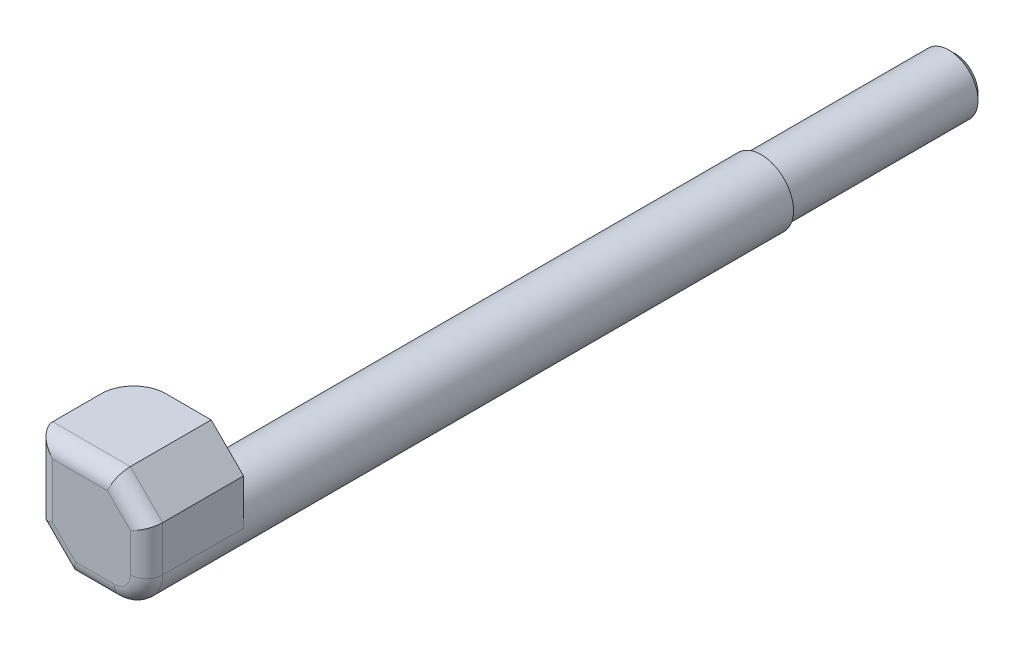
ISO-10303-21;
HEADER;
FILE_DESCRIPTION(('STEP AP214'),'2;1');
FILE_NAME('part.step','',(''),(''),'','','');
FILE_SCHEMA(('AUTOMOTIVE_DESIGN { 1 0 10303 214 1 1 1 1 }'));
ENDSEC;
DATA;
#1=APPLICATION_CONTEXT('core data for automotive mechanical design processes');
#2=APPLICATION_PROTOCOL_DEFINITION('international standard','automotive_design',2000,#1);
#3=PRODUCT_CONTEXT('',#1,'mechanical');
#4=PRODUCT('Part','Part','',(#3));
#5=PRODUCT_RELATED_PRODUCT_CATEGORY('part','',(#4));
#6=PRODUCT_DEFINITION_FORMATION('','',#4);
#7=PRODUCT_DEFINITION_CONTEXT('part definition',#1,'design');
#8=PRODUCT_DEFINITION('design','',#6,#7);
#9=PRODUCT_DEFINITION_SHAPE('','',#8);
#10=(LENGTH_UNIT() NAMED_UNIT(*) SI_UNIT(.MILLI.,.METRE.));
#11=(NAMED_UNIT(*) PLANE_ANGLE_UNIT() SI_UNIT($,.RADIAN.));
#12=(NAMED_UNIT(*) SI_UNIT($,.STERADIAN.) SOLID_ANGLE_UNIT());
#13=UNCERTAINTY_MEASURE_WITH_UNIT(LENGTH_MEASURE(1.E-05),#10,'distance_accuracy_value','');
#14=(GEOMETRIC_REPRESENTATION_CONTEXT(3) GLOBAL_UNCERTAINTY_ASSIGNED_CONTEXT((#13)) GLOBAL_UNIT_ASSIGNED_CONTEXT((#10,
#11,#12)) REPRESENTATION_CONTEXT('',''));
#15=CARTESIAN_POINT('',(0.,0.,0.));
#16=DIRECTION('',(0.,0.,1.));
#17=DIRECTION('',(1.,0.,0.));
#18=AXIS2_PLACEMENT_3D('',#15,#16,#17);
#19=CARTESIAN_POINT('',(1.9,-1.352,17.5));
#20=DIRECTION('',(0.,-1.,0.));
#21=DIRECTION('',(0.,0.,-1.));
#22=AXIS2_PLACEMENT_3D('',#19,#20,#21);
#23=CYLINDRICAL_SURFACE('',#22,0.5);
#24=CARTESIAN_POINT('',(1.9,-1.9,17.5));
#25=DIRECTION('',(-0.707106781186547,-0.707106781186547,0.));
#26=DIRECTION('',(0.707106781186547,-0.707106781186547,0.));
#27=AXIS2_PLACEMENT_3D('',#24,#25,#26);
#28=ELLIPSE('',#27,0.707106781186547,0.5);
#29=CARTESIAN_POINT('',(1.9,-1.9,18.));
#30=VERTEX_POINT('',#29);
#31=CARTESIAN_POINT('',(1.4,-1.4,17.5));
#32=VERTEX_POINT('',#31);
#33=EDGE_CURVE('E114',#30,#32,#28,.T.);
#34=ORIENTED_EDGE('',*,*,#33,.T.);
#35=DIRECTION('',(0.,1.,0.));
#36=VECTOR('',#35,1.);
#37=CARTESIAN_POINT('',(1.4,-2.6,17.5));
#38=LINE('',#37,#36);
#39=CARTESIAN_POINT('',(1.39999999999984,-3.79999999999984,17.5));
#40=VERTEX_POINT('',#39);
#41=EDGE_CURVE('E113',#32,#40,#38,.F.);
#42=ORIENTED_EDGE('',*,*,#41,.T.);
#43=CARTESIAN_POINT('',(1.9,-3.592893218813,17.5));
#44=DIRECTION('',(0.38268343236509,-0.923879532511287,0.));
#45=DIRECTION('',(-0.923879532511287,-0.38268343236509,0.));
#46=AXIS2_PLACEMENT_3D('',#43,#44,#45);
#47=ELLIPSE('',#46,0.541196100146197,0.5);
#48=CARTESIAN_POINT('',(1.9,-3.592893218813,18.));
#49=VERTEX_POINT('',#48);
#50=EDGE_CURVE('E20',#40,#49,#47,.F.);
#51=ORIENTED_EDGE('',*,*,#50,.T.);
#52=DIRECTION('',(0.,-1.,0.));
#53=VECTOR('',#52,1.);
#54=CARTESIAN_POINT('',(1.9,-1.352,18.));
#55=LINE('',#54,#53);
#56=EDGE_CURVE('E111',#49,#30,#55,.F.);
#57=ORIENTED_EDGE('',*,*,#56,.T.);
#58=EDGE_LOOP('',(#34,#42,#51,#57));
#59=FACE_BOUND('',#58,.T.);
#60=ADVANCED_FACE('F16',(#59),#23,.T.);
#61=CARTESIAN_POINT('',(3.8,-3.8,-8.));
#62=DIRECTION('',(0.,0.,1.));
#63=DIRECTION('',(1.,0.,0.));
#64=AXIS2_PLACEMENT_3D('',#61,#62,#63);
#65=PLANE('',#64);
#66=CARTESIAN_POINT('',(3.8,-3.8,-8.));
#67=DIRECTION('',(0.,0.,1.));
#68=DIRECTION('',(1.,0.,0.));
#69=AXIS2_PLACEMENT_3D('',#66,#67,#68);
#70=CIRCLE('',#69,0.700167519030549);
#71=CARTESIAN_POINT('',(3.8,-4.50016751903055,-8.));
#72=VERTEX_POINT('',#71);
#73=CARTESIAN_POINT('',(3.79999999997319,-3.09983248093601,-7.99999999999068));
#74=VERTEX_POINT('',#73);
#75=EDGE_CURVE('E184',#72,#74,#70,.T.);
#76=ORIENTED_EDGE('',*,*,#75,.F.);
#77=CARTESIAN_POINT('',(3.8,-3.8,-8.));
#78=DIRECTION('',(0.,0.,1.));
#79=DIRECTION('',(1.,0.,0.));
#80=AXIS2_PLACEMENT_3D('',#77,#78,#79);
#81=CIRCLE('',#80,0.700167519030555);
#82=EDGE_CURVE('E188',#74,#72,#81,.T.);
#83=ORIENTED_EDGE('',*,*,#82,.F.);
#84=EDGE_LOOP('',(#76,#83));
#85=FACE_BOUND('',#84,.T.);
#86=ADVANCED_FACE('F256',(#85),#65,.F.);
#87=CARTESIAN_POINT('',(1.4,-2.6,16.75));
#88=DIRECTION('',(1.,0.,0.));
#89=DIRECTION('',(0.,0.,-1.));
#90=AXIS2_PLACEMENT_3D('',#87,#88,#89);
#91=PLANE('',#90);
#92=DIRECTION('',(0.,1.,0.));
#93=VECTOR('',#92,1.);
#94=CARTESIAN_POINT('',(1.4,-4.868,16.));
#95=LINE('',#94,#93);
#96=CARTESIAN_POINT('',(1.4,-3.8,16.));
#97=VERTEX_POINT('',#96);
#98=CARTESIAN_POINT('',(1.4,-1.4,16.));
#99=VERTEX_POINT('',#98);
#100=EDGE_CURVE('E133',#97,#99,#95,.T.);
#101=ORIENTED_EDGE('',*,*,#100,.F.);
#102=DIRECTION('',(0.,0.,-1.));
#103=VECTOR('',#102,1.);
#104=CARTESIAN_POINT('',(1.4,-3.8,16.75));
#105=LINE('',#104,#103);
#106=EDGE_CURVE('E118',#40,#97,#105,.T.);
#107=ORIENTED_EDGE('',*,*,#106,.F.);
#108=ORIENTED_EDGE('',*,*,#41,.F.);
#109=DIRECTION('',(0.,0.,-1.));
#110=VECTOR('',#109,1.);
#111=CARTESIAN_POINT('',(1.4,-1.4,16.75));
#112=LINE('',#111,#110);
#113=EDGE_CURVE('E135',#99,#32,#112,.F.);
#114=ORIENTED_EDGE('',*,*,#113,.F.);
#115=EDGE_LOOP('',(#101,#107,#108,#114));
#116=FACE_BOUND('',#115,.T.);
#117=ADVANCED_FACE('F131',(#116),#91,.F.);
#118=CARTESIAN_POINT('',(3.848,-1.9,17.5));
#119=DIRECTION('',(-1.,0.,0.));
#120=DIRECTION('',(0.,0.,1.));
#121=AXIS2_PLACEMENT_3D('',#118,#119,#120);
#122=CYLINDRICAL_SURFACE('',#121,0.5);
#123=ORIENTED_EDGE('',*,*,#33,.F.);
#124=DIRECTION('',(-1.,0.,0.));
#125=VECTOR('',#124,1.);
#126=CARTESIAN_POINT('',(3.848,-1.9,18.));
#127=LINE('',#126,#125);
#128=CARTESIAN_POINT('',(3.59289321881238,-1.9,18.));
#129=VERTEX_POINT('',#128);
#130=EDGE_CURVE('E140',#30,#129,#127,.F.);
#131=ORIENTED_EDGE('',*,*,#130,.T.);
#132=CARTESIAN_POINT('',(3.59289321881176,-1.9,17.5));
#133=DIRECTION('',(-0.923879532511422,0.382683432364763,0.));
#134=DIRECTION('',(-0.382683432364763,-0.923879532511422,0.));
#135=AXIS2_PLACEMENT_3D('',#132,#133,#134);
#136=ELLIPSE('',#135,0.541196100146118,0.5);
#137=CARTESIAN_POINT('',(3.79999999999933,-1.39999999999933,17.5));
#138=VERTEX_POINT('',#137);
#139=EDGE_CURVE('E137',#129,#138,#136,.T.);
#140=ORIENTED_EDGE('',*,*,#139,.T.);
#141=DIRECTION('',(1.,0.,0.));
#142=VECTOR('',#141,1.);
#143=CARTESIAN_POINT('',(2.6,-1.4,17.5));
#144=LINE('',#143,#142);
#145=EDGE_CURVE('E183',#32,#138,#144,.T.);
#146=ORIENTED_EDGE('',*,*,#145,.F.);
#147=EDGE_LOOP('',(#123,#131,#140,#146));
#148=FACE_BOUND('',#147,.T.);
#149=ADVANCED_FACE('F197',(#148),#122,.T.);
#150=CARTESIAN_POINT('',(3.8,-3.8,-7.79889922102939));
#151=DIRECTION('',(0.,0.,1.));
#152=DIRECTION('',(0.,-1.,0.));
#153=AXIS2_PLACEMENT_3D('',#150,#151,#152);
#154=CONICAL_SURFACE('',#153,0.90131642407523,0.785517805688655);
#155=CARTESIAN_POINT('',(3.8,-3.09990755150475,-8.00007505262101));
#156=CARTESIAN_POINT('',(3.79999999405363,-3.09157474211621,-7.99174423696262));
#157=CARTESIAN_POINT('',(3.79999998789494,-3.08324193275441,-7.98341342127749));
#158=CARTESIAN_POINT('',(3.79999997515289,-3.06657631406871,-7.96675178990722));
#159=CARTESIAN_POINT('',(3.79999996856954,-3.05824350474481,-7.95842097422209));
#160=CARTESIAN_POINT('',(3.79999995497818,-3.04157788609089,-7.94175934287689));
#161=CARTESIAN_POINT('',(3.79999994797017,-3.03324507676087,-7.93342852721682));
#162=CARTESIAN_POINT('',(3.79999993352949,-3.01657945802107,-7.91676689584381));
#163=CARTESIAN_POINT('',(3.79999992609682,-3.00824664861129,-7.90843608013087));
#164=CARTESIAN_POINT('',(3.79999991080683,-2.99158102987061,-7.89177444875874));
#165=CARTESIAN_POINT('',(3.7999999029495,-2.98324822053971,-7.88344363309956));
#166=CARTESIAN_POINT('',(3.79999988681019,-2.96658260188845,-7.8667820017517));
#167=CARTESIAN_POINT('',(3.79999987852821,-2.95824979256809,-7.85845118606301));
#168=CARTESIAN_POINT('',(3.79999986153959,-2.94158417387264,-7.8417895547025));
#169=CARTESIAN_POINT('',(3.79999985283294,-2.93325136449754,-7.83345873903067));
#170=CARTESIAN_POINT('',(3.79999983499501,-2.91658574574735,-7.81679710766806));
#171=CARTESIAN_POINT('',(3.79999982586371,-2.90825293637225,-7.80846629197728));
#172=CARTESIAN_POINT('',(3.79999981652008,-2.89992012702453,-7.80013547625913));
#173=B_SPLINE_CURVE_WITH_KNOTS('',3,(#155,#156,#157,#158,#159,#160,#161,#162,#163,#164,#165,
#166,#167,#168,#169,#170,#171,#172),.UNSPECIFIED.,.F.,.F.,(4,2,2,2,2,2,2,2,4),(0.,
0.0353488870625099,0.0706977740446216,0.106046660986544,0.141395548209832,0.176744435151755,
0.212093322133869,0.247442209196381,0.282791096299083),.UNSPECIFIED.);
#174=CARTESIAN_POINT('',(3.7999998887271,-2.89996697847153,-7.8001279203207));
#175=VERTEX_POINT('',#174);
#176=EDGE_CURVE('E191',#74,#175,#173,.T.);
#177=ORIENTED_EDGE('',*,*,#176,.F.);
#178=ORIENTED_EDGE('',*,*,#82,.T.);
#179=CARTESIAN_POINT('',(3.80000002947995,-4.70007987297549,-7.80013547625913));
#180=CARTESIAN_POINT('',(3.80000002797868,-4.6917464381977,-7.80846691721612));
#181=CARTESIAN_POINT('',(3.80000002651152,-4.6834130034199,-7.8167983581731));
#182=CARTESIAN_POINT('',(3.80000002364545,-4.66674613388325,-7.83346124006812));
#183=CARTESIAN_POINT('',(3.80000002224653,-4.6584126991244,-7.84179268100615));
#184=CARTESIAN_POINT('',(3.80000001951692,-4.64174582960671,-7.85845556288223));
#185=CARTESIAN_POINT('',(3.80000001818624,-4.63341239484788,-7.86678700382028));
#186=CARTESIAN_POINT('',(3.80000001559311,-4.61674552533015,-7.88344988569632));
#187=CARTESIAN_POINT('',(3.80000001433066,-4.60841209057126,-7.89178132663432));
#188=CARTESIAN_POINT('',(3.80000001187399,-4.59174522105367,-7.9084442085105));
#189=CARTESIAN_POINT('',(3.80000001067978,-4.58341178629497,-7.91677564944868));
#190=CARTESIAN_POINT('',(3.80000000835959,-4.56674491675793,-7.93343853134331));
#191=CARTESIAN_POINT('',(3.80000000723361,-4.5584114819796,-7.94176997229976));
#192=CARTESIAN_POINT('',(3.80000000504989,-4.54174461248232,-7.95843285415835));
#193=CARTESIAN_POINT('',(3.80000000399215,-4.53341117776336,-7.96676429506049));
#194=CARTESIAN_POINT('',(3.8000000019449,-4.51674430824966,-7.98342717692161));
#195=CARTESIAN_POINT('',(3.80000000095539,-4.50841087345491,-7.99175861788059));
#196=CARTESIAN_POINT('',(3.8,-4.50007743864944,-8.00009005882885));
#197=B_SPLINE_CURVE_WITH_KNOTS('',3,(#179,#180,#181,#182,#183,#184,#185,#186,#187,#188,#189,
#190,#191,#192,#193,#194,#195,#196),.UNSPECIFIED.,.F.,.F.,(4,2,2,2,2,2,2,2,4),(0.,
0.0353515401720982,0.0707030802638082,0.106054620355518,0.141406160447228,0.176757700538938,
0.212109240711037,0.247460780641969,0.282812320854267),.UNSPECIFIED.);
#198=CARTESIAN_POINT('',(3.8000000132243,-4.70003330479548,-7.80012705964933));
#199=VERTEX_POINT('',#198);
#200=EDGE_CURVE('E187',#199,#72,#197,.T.);
#201=ORIENTED_EDGE('',*,*,#200,.F.);
#202=CARTESIAN_POINT('',(3.8,-3.8,-7.80021533014231));
#203=DIRECTION('',(0.,0.,1.));
#204=DIRECTION('',(0.,-1.,0.));
#205=AXIS2_PLACEMENT_3D('',#202,#203,#204);
#206=CIRCLE('',#205,0.9);
#207=EDGE_CURVE('E170',#175,#199,#206,.T.);
#208=ORIENTED_EDGE('',*,*,#207,.F.);
#209=EDGE_LOOP('',(#177,#178,#201,#208));
#210=FACE_BOUND('',#209,.T.);
#211=ADVANCED_FACE('F254',(#210),#154,.T.);
#212=CARTESIAN_POINT('',(3.8,-3.8,-7.79893574883772));
#213=DIRECTION('',(0.,0.,1.));
#214=DIRECTION('',(1.,0.,0.));
#215=AXIS2_PLACEMENT_3D('',#212,#213,#214);
#216=CONICAL_SURFACE('',#215,0.90127988751301,0.785517805658091);
#217=ORIENTED_EDGE('',*,*,#200,.T.);
#218=ORIENTED_EDGE('',*,*,#75,.T.);
#219=ORIENTED_EDGE('',*,*,#176,.T.);
#220=CARTESIAN_POINT('',(3.8,-3.8,-7.8002153301301));
#221=DIRECTION('',(0.,0.,1.));
#222=DIRECTION('',(1.,0.,0.));
#223=AXIS2_PLACEMENT_3D('',#220,#221,#222);
#224=CIRCLE('',#223,0.9);
#225=EDGE_CURVE('E166',#199,#175,#224,.T.);
#226=ORIENTED_EDGE('',*,*,#225,.F.);
#227=EDGE_LOOP('',(#217,#218,#219,#226));
#228=FACE_BOUND('',#227,.T.);
#229=ADVANCED_FACE('F231',(#228),#216,.T.);
#230=CARTESIAN_POINT('',(2.4,-4.868,16.));
#231=DIRECTION('',(0.,1.,0.));
#232=DIRECTION('',(0.,0.,1.));
#233=AXIS2_PLACEMENT_3D('',#230,#231,#232);
#234=CYLINDRICAL_SURFACE('',#233,1.);
#235=ORIENTED_EDGE('',*,*,#100,.T.);
#236=CARTESIAN_POINT('',(2.4,-1.4,16.));
#237=DIRECTION('',(0.,1.,0.));
#238=DIRECTION('',(0.,0.,1.));
#239=AXIS2_PLACEMENT_3D('',#236,#237,#238);
#240=CIRCLE('',#239,1.);
#241=CARTESIAN_POINT('',(2.4,-1.4,15.));
#242=VERTEX_POINT('',#241);
#243=EDGE_CURVE('E180',#242,#99,#240,.T.);
#244=ORIENTED_EDGE('',*,*,#243,.F.);
#245=DIRECTION('',(0.,1.,0.));
#246=VECTOR('',#245,1.);
#247=CARTESIAN_POINT('',(2.4,-3.1,15.));
#248=LINE('',#247,#246);
#249=CARTESIAN_POINT('',(2.4,-4.8,15.));
#250=VERTEX_POINT('',#249);
#251=EDGE_CURVE('E169',#242,#250,#248,.F.);
#252=ORIENTED_EDGE('',*,*,#251,.T.);
#253=CARTESIAN_POINT('',(2.4,-4.8,16.));
#254=DIRECTION('',(0.707106781186548,0.707106781186548,0.));
#255=DIRECTION('',(-0.707106781186548,0.707106781186548,0.));
#256=AXIS2_PLACEMENT_3D('',#253,#254,#255);
#257=ELLIPSE('',#256,1.41421356237309,1.);
#258=EDGE_CURVE('E128',#250,#97,#257,.T.);
#259=ORIENTED_EDGE('',*,*,#258,.T.);
#260=EDGE_LOOP('',(#235,#244,#252,#259));
#261=FACE_BOUND('',#260,.T.);
#262=ADVANCED_FACE('F229',(#261),#234,.T.);
#263=CARTESIAN_POINT('',(2.6,-1.4,16.25));
#264=DIRECTION('',(0.,1.,0.));
#265=DIRECTION('',(0.,0.,1.));
#266=AXIS2_PLACEMENT_3D('',#263,#264,#265);
#267=PLANE('',#266);
#268=ORIENTED_EDGE('',*,*,#113,.T.);
#269=ORIENTED_EDGE('',*,*,#145,.T.);
#270=DIRECTION('',(0.,0.,1.));
#271=VECTOR('',#270,1.);
#272=CARTESIAN_POINT('',(3.8,-1.4,16.25));
#273=LINE('',#272,#271);
#274=CARTESIAN_POINT('',(3.8,-1.4,15.));
#275=VERTEX_POINT('',#274);
#276=EDGE_CURVE('E208',#275,#138,#273,.T.);
#277=ORIENTED_EDGE('',*,*,#276,.F.);
#278=DIRECTION('',(1.,0.,0.));
#279=VECTOR('',#278,1.);
#280=CARTESIAN_POINT('',(3.6,-1.4,15.));
#281=LINE('',#280,#279);
#282=EDGE_CURVE('E215',#275,#242,#281,.F.);
#283=ORIENTED_EDGE('',*,*,#282,.T.);
#284=ORIENTED_EDGE('',*,*,#243,.T.);
#285=EDGE_LOOP('',(#268,#269,#277,#283,#284));
#286=FACE_BOUND('',#285,.T.);
#287=ADVANCED_FACE('F313',(#286),#267,.T.);
#288=CARTESIAN_POINT('',(1.731117486961,-3.424010705774,17.5));
#289=DIRECTION('',(0.707106781186548,-0.707106781186548,0.));
#290=DIRECTION('',(0.707106781186548,0.707106781186548,0.));
#291=AXIS2_PLACEMENT_3D('',#288,#289,#290);
#292=CYLINDRICAL_SURFACE('',#291,0.5);
#293=CARTESIAN_POINT('',(2.607106781187,-4.3,17.5));
#294=DIRECTION('',(0.923879532511287,-0.38268343236509,0.));
#295=DIRECTION('',(0.38268343236509,0.923879532511287,0.));
#296=AXIS2_PLACEMENT_3D('',#293,#294,#295);
#297=ELLIPSE('',#296,0.541196100146197,0.5);
#298=CARTESIAN_POINT('',(2.60710683466212,-4.29999987089964,18.));
#299=VERTEX_POINT('',#298);
#300=CARTESIAN_POINT('',(2.40000000000016,-4.80000000000016,17.5));
#301=VERTEX_POINT('',#300);
#302=EDGE_CURVE('E163',#299,#301,#297,.T.);
#303=ORIENTED_EDGE('',*,*,#302,.F.);
#304=DIRECTION('',(0.707106848814578,-0.70710671355851,0.));
#305=VECTOR('',#304,1.);
#306=CARTESIAN_POINT('',(1.9,-3.592893218813,18.));
#307=LINE('',#306,#305);
#308=EDGE_CURVE('E108',#49,#299,#307,.T.);
#309=ORIENTED_EDGE('',*,*,#308,.F.);
#310=ORIENTED_EDGE('',*,*,#50,.F.);
#311=DIRECTION('',(-0.707106781186548,0.707106781186548,0.));
#312=VECTOR('',#311,1.);
#313=CARTESIAN_POINT('',(1.9,-4.3,17.5));
#314=LINE('',#313,#312);
#315=EDGE_CURVE('E105',#40,#301,#314,.F.);
#316=ORIENTED_EDGE('',*,*,#315,.T.);
#317=EDGE_LOOP('',(#303,#309,#310,#316));
#318=FACE_BOUND('',#317,.T.);
#319=ADVANCED_FACE('F103',(#318),#292,.T.);
#320=CARTESIAN_POINT('',(4.468882513039,-2.775989294226,17.5));
#321=DIRECTION('',(-0.707106781187048,0.707106781186048,0.));
#322=DIRECTION('',(-0.707106781186048,-0.707106781187048,0.));
#323=AXIS2_PLACEMENT_3D('',#320,#321,#322);
#324=CYLINDRICAL_SURFACE('',#323,0.5);
#325=CARTESIAN_POINT('',(4.3,-2.60710678118724,17.5));
#326=DIRECTION('',(-0.382683432365416,0.923879532511152,0.));
#327=DIRECTION('',(0.923879532511151,0.382683432365416,0.));
#328=AXIS2_PLACEMENT_3D('',#325,#326,#327);
#329=ELLIPSE('',#328,0.541196100146276,0.5);
#330=CARTESIAN_POINT('',(4.80000000000017,-2.40000000000017,17.5));
#331=VERTEX_POINT('',#330);
#332=CARTESIAN_POINT('',(4.30000003364707,-2.60710671966604,18.));
#333=VERTEX_POINT('',#332);
#334=EDGE_CURVE('E159',#331,#333,#329,.F.);
#335=ORIENTED_EDGE('',*,*,#334,.F.);
#336=DIRECTION('',(-0.707106781186548,0.707106781186548,0.));
#337=VECTOR('',#336,1.);
#338=CARTESIAN_POINT('',(4.3,-1.9,17.5));
#339=LINE('',#338,#337);
#340=EDGE_CURVE('E165',#138,#331,#339,.F.);
#341=ORIENTED_EDGE('',*,*,#340,.F.);
#342=ORIENTED_EDGE('',*,*,#139,.F.);
#343=DIRECTION('',(-0.707106828770562,0.70710673360253,0.));
#344=VECTOR('',#343,1.);
#345=CARTESIAN_POINT('',(4.299999809663,-2.607106495682,18.));
#346=LINE('',#345,#344);
#347=EDGE_CURVE('E129',#333,#129,#346,.T.);
#348=ORIENTED_EDGE('',*,*,#347,.F.);
#349=EDGE_LOOP('',(#335,#341,#342,#348));
#350=FACE_BOUND('',#349,.T.);
#351=ADVANCED_FACE('F309',(#350),#324,.T.);
#352=CARTESIAN_POINT('',(3.099999857247,-3.099999857248,18.));
#353=DIRECTION('',(0.,0.,1.));
#354=DIRECTION('',(1.,0.,0.));
#355=AXIS2_PLACEMENT_3D('',#352,#353,#354);
#356=PLANE('',#355);
#357=DIRECTION('',(0.,1.,0.));
#358=VECTOR('',#357,1.);
#359=CARTESIAN_POINT('',(4.3,-3.099999857248,18.));
#360=LINE('',#359,#358);
#361=CARTESIAN_POINT('',(4.3,-3.79999999972135,17.9999999999967));
#362=VERTEX_POINT('',#361);
#363=EDGE_CURVE('E156',#333,#362,#360,.F.);
#364=ORIENTED_EDGE('',*,*,#363,.F.);
#365=ORIENTED_EDGE('',*,*,#347,.T.);
#366=ORIENTED_EDGE('',*,*,#130,.F.);
#367=ORIENTED_EDGE('',*,*,#56,.F.);
#368=ORIENTED_EDGE('',*,*,#308,.T.);
#369=DIRECTION('',(1.,0.,0.));
#370=VECTOR('',#369,1.);
#371=CARTESIAN_POINT('',(2.368270840799,-4.3,18.));
#372=LINE('',#371,#370);
#373=CARTESIAN_POINT('',(3.79999995266446,-4.3,17.9999999999967));
#374=VERTEX_POINT('',#373);
#375=EDGE_CURVE('E162',#374,#299,#372,.F.);
#376=ORIENTED_EDGE('',*,*,#375,.F.);
#377=CARTESIAN_POINT('',(3.80000000000072,-3.79999999999982,17.9999999999933));
#378=DIRECTION('',(0.,0.,1.));
#379=DIRECTION('',(1.,0.,0.));
#380=AXIS2_PLACEMENT_3D('',#377,#378,#379);
#381=CIRCLE('',#380,0.499999999999285);
#382=EDGE_CURVE('E178',#374,#362,#381,.T.);
#383=ORIENTED_EDGE('',*,*,#382,.T.);
#384=EDGE_LOOP('',(#364,#365,#366,#367,#368,#376,#383));
#385=FACE_BOUND('',#384,.T.);
#386=ADVANCED_FACE('F202',(#385),#356,.T.);
#387=CARTESIAN_POINT('',(1.9,-4.3,16.25));
#388=DIRECTION('',(0.707106781186548,0.707106781186548,0.));
#389=DIRECTION('',(-0.707106781186548,0.707106781186548,0.));
#390=AXIS2_PLACEMENT_3D('',#387,#388,#389);
#391=PLANE('',#390);
#392=ORIENTED_EDGE('',*,*,#258,.F.);
#393=DIRECTION('',(0.,0.,1.));
#394=VECTOR('',#393,1.);
#395=CARTESIAN_POINT('',(2.4,-4.8,16.25));
#396=LINE('',#395,#394);
#397=EDGE_CURVE('E126',#250,#301,#396,.T.);
#398=ORIENTED_EDGE('',*,*,#397,.T.);
#399=ORIENTED_EDGE('',*,*,#315,.F.);
#400=ORIENTED_EDGE('',*,*,#106,.T.);
#401=EDGE_LOOP('',(#392,#398,#399,#400));
#402=FACE_BOUND('',#401,.T.);
#403=ADVANCED_FACE('F123',(#402),#391,.F.);
#404=CARTESIAN_POINT('',(3.8,-3.8,-1.883998016672));
#405=DIRECTION('',(0.,0.,-1.));
#406=DIRECTION('',(-1.,0.,0.));
#407=AXIS2_PLACEMENT_3D('',#404,#405,#406);
#408=CYLINDRICAL_SURFACE('',#407,0.9);
#409=CARTESIAN_POINT('',(3.8,-3.8,-2.));
#410=DIRECTION('',(0.,0.,-1.));
#411=DIRECTION('',(-1.,0.,0.));
#412=AXIS2_PLACEMENT_3D('',#409,#410,#411);
#413=CIRCLE('',#412,0.9);
#414=CARTESIAN_POINT('',(2.9,-3.8,-2.));
#415=VERTEX_POINT('',#414);
#416=EDGE_CURVE('E153',#415,#415,#413,.T.);
#417=ORIENTED_EDGE('',*,*,#416,.T.);
#418=EDGE_LOOP('',(#417));
#419=FACE_BOUND('',#418,.T.);
#420=ORIENTED_EDGE('',*,*,#207,.T.);
#421=ORIENTED_EDGE('',*,*,#225,.T.);
#422=EDGE_LOOP('',(#420,#421));
#423=FACE_BOUND('',#422,.T.);
#424=ADVANCED_FACE('F253',(#419,#423),#408,.T.);
#425=CARTESIAN_POINT('',(3.6,-3.1,15.));
#426=DIRECTION('',(0.,0.,1.));
#427=DIRECTION('',(1.,0.,0.));
#428=AXIS2_PLACEMENT_3D('',#425,#426,#427);
#429=PLANE('',#428);
#430=DIRECTION('',(-0.707106781186548,0.707106781186548,0.));
#431=VECTOR('',#430,1.);
#432=CARTESIAN_POINT('',(4.3,-1.9,15.));
#433=LINE('',#432,#431);
#434=CARTESIAN_POINT('',(4.8,-2.4,15.));
#435=VERTEX_POINT('',#434);
#436=EDGE_CURVE('E211',#435,#275,#433,.T.);
#437=ORIENTED_EDGE('',*,*,#436,.F.);
#438=DIRECTION('',(0.,1.,0.));
#439=VECTOR('',#438,1.);
#440=CARTESIAN_POINT('',(4.8,-3.1,15.));
#441=LINE('',#440,#439);
#442=CARTESIAN_POINT('',(4.8,-3.799999999443,15.));
#443=VERTEX_POINT('',#442);
#444=EDGE_CURVE('E218',#443,#435,#441,.T.);
#445=ORIENTED_EDGE('',*,*,#444,.F.);
#446=CARTESIAN_POINT('',(3.8,-3.8,15.));
#447=DIRECTION('',(0.,0.,1.));
#448=DIRECTION('',(1.,0.,0.));
#449=AXIS2_PLACEMENT_3D('',#446,#447,#448);
#450=CIRCLE('',#449,1.);
#451=CARTESIAN_POINT('',(3.7999999718205,-4.8,15.));
#452=VERTEX_POINT('',#451);
#453=EDGE_CURVE('E150',#452,#443,#450,.F.);
#454=ORIENTED_EDGE('',*,*,#453,.F.);
#455=DIRECTION('',(1.,0.,0.));
#456=VECTOR('',#455,1.);
#457=CARTESIAN_POINT('',(3.099999990477,-4.8,15.));
#458=LINE('',#457,#456);
#459=EDGE_CURVE('E326',#452,#250,#458,.F.);
#460=ORIENTED_EDGE('',*,*,#459,.T.);
#461=ORIENTED_EDGE('',*,*,#251,.F.);
#462=ORIENTED_EDGE('',*,*,#282,.F.);
#463=EDGE_LOOP('',(#437,#445,#454,#460,#461,#462));
#464=FACE_BOUND('',#463,.T.);
#465=ADVANCED_FACE('F297',(#464),#429,.F.);
#466=CARTESIAN_POINT('',(4.3,-1.9,16.25));
#467=DIRECTION('',(0.707106781186548,0.707106781186548,0.));
#468=DIRECTION('',(-0.707106781186548,0.707106781186548,0.));
#469=AXIS2_PLACEMENT_3D('',#466,#467,#468);
#470=PLANE('',#469);
#471=ORIENTED_EDGE('',*,*,#276,.T.);
#472=ORIENTED_EDGE('',*,*,#340,.T.);
#473=DIRECTION('',(0.,0.,-1.));
#474=VECTOR('',#473,1.);
#475=CARTESIAN_POINT('',(4.8,-2.4,16.25));
#476=LINE('',#475,#474);
#477=EDGE_CURVE('E152',#435,#331,#476,.F.);
#478=ORIENTED_EDGE('',*,*,#477,.F.);
#479=ORIENTED_EDGE('',*,*,#436,.T.);
#480=EDGE_LOOP('',(#471,#472,#478,#479));
#481=FACE_BOUND('',#480,.T.);
#482=ADVANCED_FACE('F293',(#481),#470,.T.);
#483=CARTESIAN_POINT('',(2.368270840799,-4.3,17.5));
#484=DIRECTION('',(1.,0.,0.));
#485=DIRECTION('',(0.,0.,-1.));
#486=AXIS2_PLACEMENT_3D('',#483,#484,#485);
#487=CYLINDRICAL_SURFACE('',#486,0.5);
#488=CARTESIAN_POINT('',(3.79999990532784,-4.30000000000714,17.4999999999949));
#489=DIRECTION('',(0.999999999999982,-1.89342906652194E-07,-7.37086627899336E-13));
#490=DIRECTION('',(1.89342906652194E-07,0.999999999999982,0.));
#491=AXIS2_PLACEMENT_3D('',#488,#489,#490);
#492=CIRCLE('',#491,0.4999999999985);
#493=CARTESIAN_POINT('',(3.79999991039485,-4.80000000000141,17.5));
#494=VERTEX_POINT('',#493);
#495=EDGE_CURVE('E353',#374,#494,#492,.T.);
#496=ORIENTED_EDGE('',*,*,#495,.F.);
#497=ORIENTED_EDGE('',*,*,#375,.T.);
#498=ORIENTED_EDGE('',*,*,#302,.T.);
#499=DIRECTION('',(1.,0.,0.));
#500=VECTOR('',#499,1.);
#501=CARTESIAN_POINT('',(3.099999990477,-4.8,17.5));
#502=LINE('',#501,#500);
#503=EDGE_CURVE('E158',#301,#494,#502,.T.);
#504=ORIENTED_EDGE('',*,*,#503,.T.);
#505=EDGE_LOOP('',(#496,#497,#498,#504));
#506=FACE_BOUND('',#505,.T.);
#507=ADVANCED_FACE('F290',(#506),#487,.T.);
#508=CARTESIAN_POINT('',(4.3,-3.831729157842,17.5));
#509=DIRECTION('',(0.,1.,0.));
#510=DIRECTION('',(0.,0.,1.));
#511=AXIS2_PLACEMENT_3D('',#508,#509,#510);
#512=CYLINDRICAL_SURFACE('',#511,0.5);
#513=CARTESIAN_POINT('',(4.30000000000751,-3.79999999944292,17.4999999999952));
#514=DIRECTION('',(1.11367271830189E-09,-1.,0.));
#515=DIRECTION('',(1.,1.11367271830189E-09,0.));
#516=AXIS2_PLACEMENT_3D('',#513,#514,#515);
#517=CIRCLE('',#516,0.499999999998244);
#518=CARTESIAN_POINT('',(4.8,-3.799999999443,17.5));
#519=VERTEX_POINT('',#518);
#520=EDGE_CURVE('E35',#519,#362,#517,.T.);
#521=ORIENTED_EDGE('',*,*,#520,.F.);
#522=DIRECTION('',(0.,1.,0.));
#523=VECTOR('',#522,1.);
#524=CARTESIAN_POINT('',(4.8,-3.099999999755,17.5));
#525=LINE('',#524,#523);
#526=EDGE_CURVE('E346',#331,#519,#525,.F.);
#527=ORIENTED_EDGE('',*,*,#526,.F.);
#528=ORIENTED_EDGE('',*,*,#334,.T.);
#529=ORIENTED_EDGE('',*,*,#363,.T.);
#530=EDGE_LOOP('',(#521,#527,#528,#529));
#531=FACE_BOUND('',#530,.T.);
#532=ADVANCED_FACE('F286',(#531),#512,.T.);
#533=CARTESIAN_POINT('',(3.099999990477,-4.8,16.25));
#534=DIRECTION('',(0.,1.,0.));
#535=DIRECTION('',(0.,0.,1.));
#536=AXIS2_PLACEMENT_3D('',#533,#534,#535);
#537=PLANE('',#536);
#538=ORIENTED_EDGE('',*,*,#459,.F.);
#539=DIRECTION('',(0.,0.,1.));
#540=VECTOR('',#539,1.);
#541=CARTESIAN_POINT('',(3.799999943641,-4.8,-2.39));
#542=LINE('',#541,#540);
#543=EDGE_CURVE('E149',#494,#452,#542,.F.);
#544=ORIENTED_EDGE('',*,*,#543,.F.);
#545=ORIENTED_EDGE('',*,*,#503,.F.);
#546=ORIENTED_EDGE('',*,*,#397,.F.);
#547=EDGE_LOOP('',(#538,#544,#545,#546));
#548=FACE_BOUND('',#547,.T.);
#549=ADVANCED_FACE('F282',(#548),#537,.F.);
#550=CARTESIAN_POINT('',(3.8,-3.8,-2.));
#551=DIRECTION('',(0.,0.,1.));
#552=DIRECTION('',(1.,0.,0.));
#553=AXIS2_PLACEMENT_3D('',#550,#551,#552);
#554=PLANE('',#553);
#555=ORIENTED_EDGE('',*,*,#416,.F.);
#556=EDGE_LOOP('',(#555));
#557=FACE_BOUND('',#556,.T.);
#558=CARTESIAN_POINT('',(3.8,-3.8,-2.));
#559=DIRECTION('',(0.,0.,1.));
#560=DIRECTION('',(1.,0.,0.));
#561=AXIS2_PLACEMENT_3D('',#558,#559,#560);
#562=CIRCLE('',#561,1.);
#563=CARTESIAN_POINT('',(4.8,-3.8,-2.));
#564=VERTEX_POINT('',#563);
#565=EDGE_CURVE('E146',#564,#564,#562,.T.);
#566=ORIENTED_EDGE('',*,*,#565,.F.);
#567=EDGE_LOOP('',(#566));
#568=FACE_BOUND('',#567,.T.);
#569=ADVANCED_FACE('F278',(#557,#568),#554,.F.);
#570=CARTESIAN_POINT('',(4.8,-3.099999999755,16.25));
#571=DIRECTION('',(1.,0.,0.));
#572=DIRECTION('',(0.,0.,-1.));
#573=AXIS2_PLACEMENT_3D('',#570,#571,#572);
#574=PLANE('',#573);
#575=ORIENTED_EDGE('',*,*,#477,.T.);
#576=ORIENTED_EDGE('',*,*,#526,.T.);
#577=DIRECTION('',(0.,0.,-1.));
#578=VECTOR('',#577,1.);
#579=CARTESIAN_POINT('',(4.8,-3.799999998886,16.25));
#580=LINE('',#579,#578);
#581=EDGE_CURVE('E26',#443,#519,#580,.F.);
#582=ORIENTED_EDGE('',*,*,#581,.F.);
#583=ORIENTED_EDGE('',*,*,#444,.T.);
#584=EDGE_LOOP('',(#575,#576,#582,#583));
#585=FACE_BOUND('',#584,.T.);
#586=ADVANCED_FACE('F272',(#585),#574,.T.);
#587=CARTESIAN_POINT('',(3.80000000000072,-3.79999999999982,17.4999999999949));
#588=DIRECTION('',(0.,0.,1.));
#589=DIRECTION('',(1.,0.,0.));
#590=AXIS2_PLACEMENT_3D('',#587,#588,#589);
#591=TOROIDAL_SURFACE('',#590,0.500000000007402,0.499999999998461);
#592=ORIENTED_EDGE('',*,*,#520,.T.);
#593=ORIENTED_EDGE('',*,*,#382,.F.);
#594=ORIENTED_EDGE('',*,*,#495,.T.);
#595=CARTESIAN_POINT('',(3.8,-3.8,17.5));
#596=DIRECTION('',(0.,0.,1.));
#597=DIRECTION('',(1.,0.,0.));
#598=AXIS2_PLACEMENT_3D('',#595,#596,#597);
#599=CIRCLE('',#598,1.);
#600=EDGE_CURVE('E11',#519,#494,#599,.F.);
#601=ORIENTED_EDGE('',*,*,#600,.F.);
#602=EDGE_LOOP('',(#592,#593,#594,#601));
#603=FACE_BOUND('',#602,.T.);
#604=ADVANCED_FACE('F18',(#603),#591,.T.);
#605=CARTESIAN_POINT('',(3.8,-3.8,-2.39));
#606=DIRECTION('',(0.,0.,1.));
#607=DIRECTION('',(1.,0.,0.));
#608=AXIS2_PLACEMENT_3D('',#605,#606,#607);
#609=CYLINDRICAL_SURFACE('',#608,1.);
#610=ORIENTED_EDGE('',*,*,#565,.T.);
#611=EDGE_LOOP('',(#610));
#612=FACE_BOUND('',#611,.T.);
#613=ORIENTED_EDGE('',*,*,#581,.T.);
#614=ORIENTED_EDGE('',*,*,#600,.T.);
#615=ORIENTED_EDGE('',*,*,#543,.T.);
#616=ORIENTED_EDGE('',*,*,#453,.T.);
#617=EDGE_LOOP('',(#613,#614,#615,#616));
#618=FACE_BOUND('',#617,.T.);
#619=ADVANCED_FACE('F265',(#612,#618),#609,.T.);
#620=CLOSED_SHELL('',(#60,#86,#117,#149,#211,#229,#262,#287,#319,#351,#386,#403,#424,#465,#482,
#507,#532,#549,#569,#586,#604,#619));
#621=MANIFOLD_SOLID_BREP('B1',#620);
#622=ADVANCED_BREP_SHAPE_REPRESENTATION('',(#18,#621),#14);
#623=SHAPE_DEFINITION_REPRESENTATION(#9,#622);
ENDSEC;
END-ISO-10303-21;
